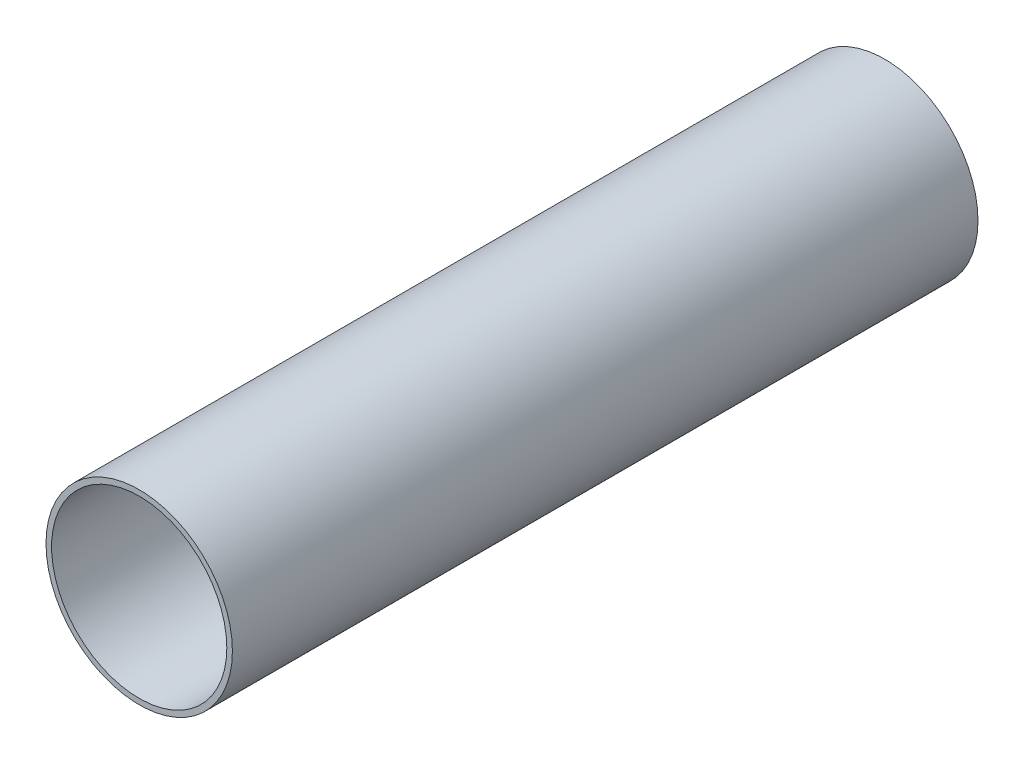
ISO-10303-21;
HEADER;
FILE_DESCRIPTION(('STEP AP214'),'2;1');
FILE_NAME('part.step','',(''),(''),'','','');
FILE_SCHEMA(('AUTOMOTIVE_DESIGN { 1 0 10303 214 1 1 1 1 }'));
ENDSEC;
DATA;
#1=APPLICATION_CONTEXT('core data for automotive mechanical design processes');
#2=APPLICATION_PROTOCOL_DEFINITION('international standard','automotive_design',2000,#1);
#3=PRODUCT_CONTEXT('',#1,'mechanical');
#4=PRODUCT('Part','Part','',(#3));
#5=PRODUCT_RELATED_PRODUCT_CATEGORY('part','',(#4));
#6=PRODUCT_DEFINITION_FORMATION('','',#4);
#7=PRODUCT_DEFINITION_CONTEXT('part definition',#1,'design');
#8=PRODUCT_DEFINITION('design','',#6,#7);
#9=PRODUCT_DEFINITION_SHAPE('','',#8);
#10=(LENGTH_UNIT() NAMED_UNIT(*) SI_UNIT(.MILLI.,.METRE.));
#11=(NAMED_UNIT(*) PLANE_ANGLE_UNIT() SI_UNIT($,.RADIAN.));
#12=(NAMED_UNIT(*) SI_UNIT($,.STERADIAN.) SOLID_ANGLE_UNIT());
#13=UNCERTAINTY_MEASURE_WITH_UNIT(LENGTH_MEASURE(1.E-05),#10,'distance_accuracy_value','');
#14=(GEOMETRIC_REPRESENTATION_CONTEXT(3) GLOBAL_UNCERTAINTY_ASSIGNED_CONTEXT((#13)) GLOBAL_UNIT_ASSIGNED_CONTEXT((#10,
#11,#12)) REPRESENTATION_CONTEXT('',''));
#15=CARTESIAN_POINT('',(0.,0.,0.));
#16=DIRECTION('',(0.,0.,1.));
#17=DIRECTION('',(1.,0.,0.));
#18=AXIS2_PLACEMENT_3D('',#15,#16,#17);
#19=CARTESIAN_POINT('',(0.,0.,400.));
#20=DIRECTION('',(0.,0.,1.));
#21=DIRECTION('',(1.,0.,0.));
#22=AXIS2_PLACEMENT_3D('',#19,#20,#21);
#23=PLANE('',#22);
#24=CARTESIAN_POINT('',(0.,0.,400.));
#25=DIRECTION('',(0.,0.,1.));
#26=DIRECTION('',(1.,0.,0.));
#27=AXIS2_PLACEMENT_3D('',#24,#25,#26);
#28=CIRCLE('',#27,50.);
#29=CARTESIAN_POINT('',(50.,0.,400.));
#30=VERTEX_POINT('',#29);
#31=EDGE_CURVE('E10',#30,#30,#28,.T.);
#32=ORIENTED_EDGE('',*,*,#31,.T.);
#33=EDGE_LOOP('',(#32));
#34=FACE_BOUND('',#33,.T.);
#35=CARTESIAN_POINT('',(0.,0.,400.));
#36=DIRECTION('',(0.,0.,1.));
#37=DIRECTION('',(1.,0.,0.));
#38=AXIS2_PLACEMENT_3D('',#35,#36,#37);
#39=CIRCLE('',#38,47.);
#40=CARTESIAN_POINT('',(47.,0.,400.));
#41=VERTEX_POINT('',#40);
#42=EDGE_CURVE('E41',#41,#41,#39,.T.);
#43=ORIENTED_EDGE('',*,*,#42,.F.);
#44=EDGE_LOOP('',(#43));
#45=FACE_BOUND('',#44,.T.);
#46=ADVANCED_FACE('F30',(#34,#45),#23,.T.);
#47=CARTESIAN_POINT('',(0.,0.,0.));
#48=DIRECTION('',(0.,0.,1.));
#49=DIRECTION('',(1.,0.,0.));
#50=AXIS2_PLACEMENT_3D('',#47,#48,#49);
#51=PLANE('',#50);
#52=CARTESIAN_POINT('',(0.,0.,0.));
#53=DIRECTION('',(0.,0.,1.));
#54=DIRECTION('',(1.,0.,0.));
#55=AXIS2_PLACEMENT_3D('',#52,#53,#54);
#56=CIRCLE('',#55,50.);
#57=CARTESIAN_POINT('',(50.,0.,0.));
#58=VERTEX_POINT('',#57);
#59=EDGE_CURVE('E34',#58,#58,#56,.T.);
#60=ORIENTED_EDGE('',*,*,#59,.F.);
#61=EDGE_LOOP('',(#60));
#62=FACE_BOUND('',#61,.T.);
#63=CARTESIAN_POINT('',(0.,0.,0.));
#64=DIRECTION('',(0.,0.,1.));
#65=DIRECTION('',(1.,0.,0.));
#66=AXIS2_PLACEMENT_3D('',#63,#64,#65);
#67=CIRCLE('',#66,47.);
#68=CARTESIAN_POINT('',(47.,0.,0.));
#69=VERTEX_POINT('',#68);
#70=EDGE_CURVE('E43',#69,#69,#67,.T.);
#71=ORIENTED_EDGE('',*,*,#70,.T.);
#72=EDGE_LOOP('',(#71));
#73=FACE_BOUND('',#72,.T.);
#74=ADVANCED_FACE('F53',(#62,#73),#51,.F.);
#75=CARTESIAN_POINT('',(0.,0.,400.));
#76=DIRECTION('',(0.,0.,-1.));
#77=DIRECTION('',(-1.,0.,0.));
#78=AXIS2_PLACEMENT_3D('',#75,#76,#77);
#79=CYLINDRICAL_SURFACE('',#78,50.);
#80=ORIENTED_EDGE('',*,*,#31,.F.);
#81=EDGE_LOOP('',(#80));
#82=FACE_BOUND('',#81,.T.);
#83=ORIENTED_EDGE('',*,*,#59,.T.);
#84=EDGE_LOOP('',(#83));
#85=FACE_BOUND('',#84,.T.);
#86=ADVANCED_FACE('F32',(#82,#85),#79,.T.);
#87=CARTESIAN_POINT('',(0.,0.,400.));
#88=DIRECTION('',(0.,0.,-1.));
#89=DIRECTION('',(-1.,0.,0.));
#90=AXIS2_PLACEMENT_3D('',#87,#88,#89);
#91=CYLINDRICAL_SURFACE('',#90,47.);
#92=ORIENTED_EDGE('',*,*,#42,.T.);
#93=EDGE_LOOP('',(#92));
#94=FACE_BOUND('',#93,.T.);
#95=ORIENTED_EDGE('',*,*,#70,.F.);
#96=EDGE_LOOP('',(#95));
#97=FACE_BOUND('',#96,.T.);
#98=ADVANCED_FACE('F49',(#94,#97),#91,.F.);
#99=CLOSED_SHELL('',(#46,#74,#86,#98));
#100=MANIFOLD_SOLID_BREP('B2',#99);
#101=ADVANCED_BREP_SHAPE_REPRESENTATION('',(#18,#100),#14);
#102=SHAPE_DEFINITION_REPRESENTATION(#9,#101);
ENDSEC;
END-ISO-10303-21;
